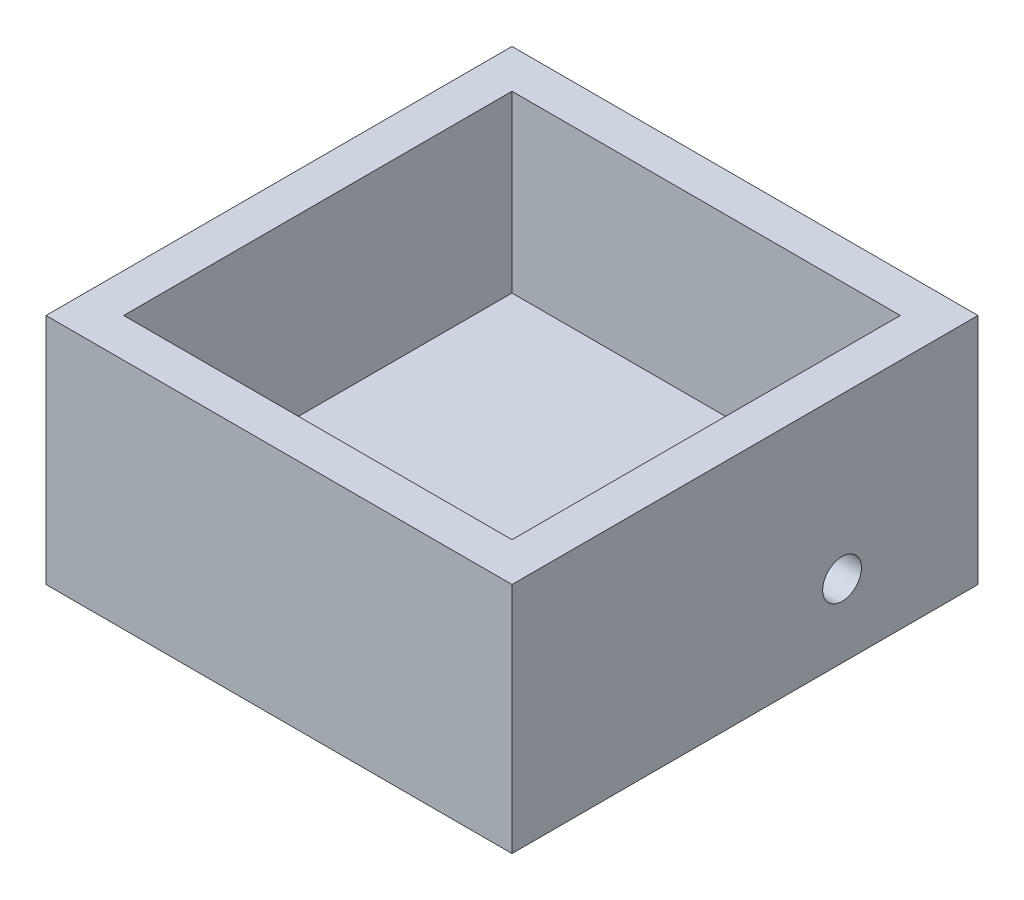
ISO-10303-21;
HEADER;
FILE_DESCRIPTION(('STEP AP214'),'2;1');
FILE_NAME('part.step','',(''),(''),'','','');
FILE_SCHEMA(('AUTOMOTIVE_DESIGN { 1 0 10303 214 1 1 1 1 }'));
ENDSEC;
DATA;
#1=APPLICATION_CONTEXT('core data for automotive mechanical design processes');
#2=APPLICATION_PROTOCOL_DEFINITION('international standard','automotive_design',2000,#1);
#3=PRODUCT_CONTEXT('',#1,'mechanical');
#4=PRODUCT('Part','Part','',(#3));
#5=PRODUCT_RELATED_PRODUCT_CATEGORY('part','',(#4));
#6=PRODUCT_DEFINITION_FORMATION('','',#4);
#7=PRODUCT_DEFINITION_CONTEXT('part definition',#1,'design');
#8=PRODUCT_DEFINITION('design','',#6,#7);
#9=PRODUCT_DEFINITION_SHAPE('','',#8);
#10=(LENGTH_UNIT() NAMED_UNIT(*) SI_UNIT(.MILLI.,.METRE.));
#11=(NAMED_UNIT(*) PLANE_ANGLE_UNIT() SI_UNIT($,.RADIAN.));
#12=(NAMED_UNIT(*) SI_UNIT($,.STERADIAN.) SOLID_ANGLE_UNIT());
#13=UNCERTAINTY_MEASURE_WITH_UNIT(LENGTH_MEASURE(1.E-05),#10,'distance_accuracy_value','');
#14=(GEOMETRIC_REPRESENTATION_CONTEXT(3) GLOBAL_UNCERTAINTY_ASSIGNED_CONTEXT((#13)) GLOBAL_UNIT_ASSIGNED_CONTEXT((#10,
#11,#12)) REPRESENTATION_CONTEXT('',''));
#15=CARTESIAN_POINT('',(0.,0.,0.));
#16=DIRECTION('',(0.,0.,1.));
#17=DIRECTION('',(1.,0.,0.));
#18=AXIS2_PLACEMENT_3D('',#15,#16,#17);
#19=CARTESIAN_POINT('',(0.,4.,0.));
#20=DIRECTION('',(0.,1.,0.));
#21=DIRECTION('',(0.,0.,1.));
#22=AXIS2_PLACEMENT_3D('',#19,#20,#21);
#23=PLANE('',#22);
#24=DIRECTION('',(0.,0.,1.));
#25=VECTOR('',#24,1.);
#26=CARTESIAN_POINT('',(-20.,4.,-20.));
#27=LINE('',#26,#25);
#28=CARTESIAN_POINT('',(-20.,4.,-20.));
#29=VERTEX_POINT('',#28);
#30=CARTESIAN_POINT('',(-20.,4.,20.));
#31=VERTEX_POINT('',#30);
#32=EDGE_CURVE('E160',#29,#31,#27,.T.);
#33=ORIENTED_EDGE('',*,*,#32,.T.);
#34=DIRECTION('',(1.,0.,0.));
#35=VECTOR('',#34,1.);
#36=CARTESIAN_POINT('',(-20.,4.,20.));
#37=LINE('',#36,#35);
#38=CARTESIAN_POINT('',(20.,4.,20.));
#39=VERTEX_POINT('',#38);
#40=EDGE_CURVE('E64',#31,#39,#37,.T.);
#41=ORIENTED_EDGE('',*,*,#40,.T.);
#42=DIRECTION('',(0.,0.,1.));
#43=VECTOR('',#42,1.);
#44=CARTESIAN_POINT('',(20.,4.,-20.));
#45=LINE('',#44,#43);
#46=CARTESIAN_POINT('',(20.,4.,-20.));
#47=VERTEX_POINT('',#46);
#48=EDGE_CURVE('E171',#47,#39,#45,.T.);
#49=ORIENTED_EDGE('',*,*,#48,.F.);
#50=DIRECTION('',(1.,0.,0.));
#51=VECTOR('',#50,1.);
#52=CARTESIAN_POINT('',(-20.,4.,-20.));
#53=LINE('',#52,#51);
#54=EDGE_CURVE('E174',#29,#47,#53,.T.);
#55=ORIENTED_EDGE('',*,*,#54,.F.);
#56=EDGE_LOOP('',(#33,#41,#49,#55));
#57=FACE_BOUND('',#56,.T.);
#58=DIRECTION('',(1.,0.,0.));
#59=VECTOR('',#58,1.);
#60=CARTESIAN_POINT('',(-15.,4.,15.));
#61=LINE('',#60,#59);
#62=CARTESIAN_POINT('',(-15.,4.,15.));
#63=VERTEX_POINT('',#62);
#64=CARTESIAN_POINT('',(15.,4.,15.));
#65=VERTEX_POINT('',#64);
#66=EDGE_CURVE('E455',#63,#65,#61,.T.);
#67=ORIENTED_EDGE('',*,*,#66,.F.);
#68=DIRECTION('',(0.,0.,1.));
#69=VECTOR('',#68,1.);
#70=CARTESIAN_POINT('',(-15.,4.,-15.));
#71=LINE('',#70,#69);
#72=CARTESIAN_POINT('',(-15.,4.,-15.));
#73=VERTEX_POINT('',#72);
#74=EDGE_CURVE('E157',#73,#63,#71,.T.);
#75=ORIENTED_EDGE('',*,*,#74,.F.);
#76=DIRECTION('',(-1.,0.,0.));
#77=VECTOR('',#76,1.);
#78=CARTESIAN_POINT('',(-15.,4.,-15.));
#79=LINE('',#78,#77);
#80=CARTESIAN_POINT('',(15.,4.,-15.));
#81=VERTEX_POINT('',#80);
#82=EDGE_CURVE('E153',#81,#73,#79,.T.);
#83=ORIENTED_EDGE('',*,*,#82,.F.);
#84=DIRECTION('',(0.,0.,-1.));
#85=VECTOR('',#84,1.);
#86=CARTESIAN_POINT('',(15.,4.,-15.));
#87=LINE('',#86,#85);
#88=EDGE_CURVE('E458',#65,#81,#87,.T.);
#89=ORIENTED_EDGE('',*,*,#88,.F.);
#90=EDGE_LOOP('',(#67,#75,#83,#89));
#91=FACE_BOUND('',#90,.T.);
#92=ADVANCED_FACE('F39',(#57,#91),#23,.T.);
#93=CARTESIAN_POINT('',(0.,24.,0.));
#94=DIRECTION('',(0.,1.,0.));
#95=DIRECTION('',(0.,0.,1.));
#96=AXIS2_PLACEMENT_3D('',#93,#94,#95);
#97=PLANE('',#96);
#98=DIRECTION('',(0.,0.,1.));
#99=VECTOR('',#98,1.);
#100=CARTESIAN_POINT('',(-24.,24.,-24.));
#101=LINE('',#100,#99);
#102=CARTESIAN_POINT('',(-24.,24.,-24.));
#103=VERTEX_POINT('',#102);
#104=CARTESIAN_POINT('',(-24.,24.,24.));
#105=VERTEX_POINT('',#104);
#106=EDGE_CURVE('E204',#103,#105,#101,.T.);
#107=ORIENTED_EDGE('',*,*,#106,.T.);
#108=DIRECTION('',(1.,0.,0.));
#109=VECTOR('',#108,1.);
#110=CARTESIAN_POINT('',(-24.,24.,24.));
#111=LINE('',#110,#109);
#112=CARTESIAN_POINT('',(24.,24.,24.));
#113=VERTEX_POINT('',#112);
#114=EDGE_CURVE('E208',#105,#113,#111,.T.);
#115=ORIENTED_EDGE('',*,*,#114,.T.);
#116=DIRECTION('',(0.,0.,-1.));
#117=VECTOR('',#116,1.);
#118=CARTESIAN_POINT('',(24.,24.,-24.));
#119=LINE('',#118,#117);
#120=CARTESIAN_POINT('',(24.,24.,-24.));
#121=VERTEX_POINT('',#120);
#122=EDGE_CURVE('E212',#113,#121,#119,.T.);
#123=ORIENTED_EDGE('',*,*,#122,.T.);
#124=DIRECTION('',(-1.,0.,0.));
#125=VECTOR('',#124,1.);
#126=CARTESIAN_POINT('',(-24.,24.,-24.));
#127=LINE('',#126,#125);
#128=EDGE_CURVE('E215',#121,#103,#127,.T.);
#129=ORIENTED_EDGE('',*,*,#128,.T.);
#130=EDGE_LOOP('',(#107,#115,#123,#129));
#131=FACE_BOUND('',#130,.T.);
#132=DIRECTION('',(1.,0.,0.));
#133=VECTOR('',#132,1.);
#134=CARTESIAN_POINT('',(-20.,24.,20.));
#135=LINE('',#134,#133);
#136=CARTESIAN_POINT('',(-20.,24.,20.));
#137=VERTEX_POINT('',#136);
#138=CARTESIAN_POINT('',(20.,24.,20.));
#139=VERTEX_POINT('',#138);
#140=EDGE_CURVE('E180',#137,#139,#135,.T.);
#141=ORIENTED_EDGE('',*,*,#140,.F.);
#142=DIRECTION('',(0.,0.,1.));
#143=VECTOR('',#142,1.);
#144=CARTESIAN_POINT('',(-20.,24.,-20.));
#145=LINE('',#144,#143);
#146=CARTESIAN_POINT('',(-20.,24.,-20.));
#147=VERTEX_POINT('',#146);
#148=EDGE_CURVE('E177',#147,#137,#145,.T.);
#149=ORIENTED_EDGE('',*,*,#148,.F.);
#150=DIRECTION('',(-1.,0.,0.));
#151=VECTOR('',#150,1.);
#152=CARTESIAN_POINT('',(-20.,24.,-20.));
#153=LINE('',#152,#151);
#154=CARTESIAN_POINT('',(20.,24.,-20.));
#155=VERTEX_POINT('',#154);
#156=EDGE_CURVE('E187',#155,#147,#153,.T.);
#157=ORIENTED_EDGE('',*,*,#156,.F.);
#158=DIRECTION('',(0.,0.,-1.));
#159=VECTOR('',#158,1.);
#160=CARTESIAN_POINT('',(20.,24.,-20.));
#161=LINE('',#160,#159);
#162=EDGE_CURVE('E183',#139,#155,#161,.T.);
#163=ORIENTED_EDGE('',*,*,#162,.F.);
#164=EDGE_LOOP('',(#141,#149,#157,#163));
#165=FACE_BOUND('',#164,.T.);
#166=ADVANCED_FACE('F258',(#131,#165),#97,.T.);
#167=CARTESIAN_POINT('',(0.,0.,0.));
#168=DIRECTION('',(0.,1.,0.));
#169=DIRECTION('',(0.,0.,1.));
#170=AXIS2_PLACEMENT_3D('',#167,#168,#169);
#171=PLANE('',#170);
#172=DIRECTION('',(0.,0.,1.));
#173=VECTOR('',#172,1.);
#174=CARTESIAN_POINT('',(-24.,0.,-24.));
#175=LINE('',#174,#173);
#176=CARTESIAN_POINT('',(-24.,0.,-24.));
#177=VERTEX_POINT('',#176);
#178=CARTESIAN_POINT('',(-24.,0.,24.));
#179=VERTEX_POINT('',#178);
#180=EDGE_CURVE('E203',#177,#179,#175,.T.);
#181=ORIENTED_EDGE('',*,*,#180,.F.);
#182=DIRECTION('',(-1.,0.,0.));
#183=VECTOR('',#182,1.);
#184=CARTESIAN_POINT('',(-24.,0.,-24.));
#185=LINE('',#184,#183);
#186=CARTESIAN_POINT('',(24.,0.,-24.));
#187=VERTEX_POINT('',#186);
#188=EDGE_CURVE('E209',#187,#177,#185,.T.);
#189=ORIENTED_EDGE('',*,*,#188,.F.);
#190=DIRECTION('',(0.,0.,-1.));
#191=VECTOR('',#190,1.);
#192=CARTESIAN_POINT('',(24.,0.,-24.));
#193=LINE('',#192,#191);
#194=CARTESIAN_POINT('',(24.,0.,24.));
#195=VERTEX_POINT('',#194);
#196=EDGE_CURVE('E225',#195,#187,#193,.T.);
#197=ORIENTED_EDGE('',*,*,#196,.F.);
#198=DIRECTION('',(1.,0.,0.));
#199=VECTOR('',#198,1.);
#200=CARTESIAN_POINT('',(-24.,0.,24.));
#201=LINE('',#200,#199);
#202=EDGE_CURVE('E222',#179,#195,#201,.T.);
#203=ORIENTED_EDGE('',*,*,#202,.F.);
#204=EDGE_LOOP('',(#181,#189,#197,#203));
#205=FACE_BOUND('',#204,.T.);
#206=ADVANCED_FACE('F249',(#205),#171,.F.);
#207=CARTESIAN_POINT('',(-24.,24.,-24.));
#208=DIRECTION('',(1.,0.,0.));
#209=DIRECTION('',(0.,0.,-1.));
#210=AXIS2_PLACEMENT_3D('',#207,#208,#209);
#211=PLANE('',#210);
#212=ORIENTED_EDGE('',*,*,#180,.T.);
#213=DIRECTION('',(0.,-1.,0.));
#214=VECTOR('',#213,1.);
#215=CARTESIAN_POINT('',(-24.,24.,24.));
#216=LINE('',#215,#214);
#217=EDGE_CURVE('E11',#105,#179,#216,.T.);
#218=ORIENTED_EDGE('',*,*,#217,.F.);
#219=ORIENTED_EDGE('',*,*,#106,.F.);
#220=DIRECTION('',(0.,-1.,0.));
#221=VECTOR('',#220,1.);
#222=CARTESIAN_POINT('',(-24.,24.,-24.));
#223=LINE('',#222,#221);
#224=EDGE_CURVE('E218',#103,#177,#223,.T.);
#225=ORIENTED_EDGE('',*,*,#224,.T.);
#226=EDGE_LOOP('',(#212,#218,#219,#225));
#227=FACE_BOUND('',#226,.T.);
#228=ADVANCED_FACE('F41',(#227),#211,.F.);
#229=CARTESIAN_POINT('',(-24.,24.,24.));
#230=DIRECTION('',(0.,0.,-1.));
#231=DIRECTION('',(-1.,0.,0.));
#232=AXIS2_PLACEMENT_3D('',#229,#230,#231);
#233=PLANE('',#232);
#234=ORIENTED_EDGE('',*,*,#202,.T.);
#235=DIRECTION('',(0.,-1.,0.));
#236=VECTOR('',#235,1.);
#237=CARTESIAN_POINT('',(24.,24.,24.));
#238=LINE('',#237,#236);
#239=EDGE_CURVE('E49',#113,#195,#238,.T.);
#240=ORIENTED_EDGE('',*,*,#239,.F.);
#241=ORIENTED_EDGE('',*,*,#114,.F.);
#242=ORIENTED_EDGE('',*,*,#217,.T.);
#243=EDGE_LOOP('',(#234,#240,#241,#242));
#244=FACE_BOUND('',#243,.T.);
#245=ADVANCED_FACE('F260',(#244),#233,.F.);
#246=CARTESIAN_POINT('',(24.,24.,-24.));
#247=DIRECTION('',(-1.,0.,0.));
#248=DIRECTION('',(0.,0.,1.));
#249=AXIS2_PLACEMENT_3D('',#246,#247,#248);
#250=PLANE('',#249);
#251=CARTESIAN_POINT('',(24.,7.5,-10.));
#252=DIRECTION('',(1.,0.,0.));
#253=DIRECTION('',(0.,0.,-1.));
#254=AXIS2_PLACEMENT_3D('',#251,#252,#253);
#255=CIRCLE('',#254,2.);
#256=CARTESIAN_POINT('',(24.,7.5,-12.));
#257=VERTEX_POINT('',#256);
#258=EDGE_CURVE('E438',#257,#257,#255,.T.);
#259=ORIENTED_EDGE('',*,*,#258,.F.);
#260=EDGE_LOOP('',(#259));
#261=FACE_BOUND('',#260,.T.);
#262=ORIENTED_EDGE('',*,*,#196,.T.);
#263=DIRECTION('',(0.,-1.,0.));
#264=VECTOR('',#263,1.);
#265=CARTESIAN_POINT('',(24.,24.,-24.));
#266=LINE('',#265,#264);
#267=EDGE_CURVE('E233',#121,#187,#266,.T.);
#268=ORIENTED_EDGE('',*,*,#267,.F.);
#269=ORIENTED_EDGE('',*,*,#122,.F.);
#270=ORIENTED_EDGE('',*,*,#239,.T.);
#271=EDGE_LOOP('',(#262,#268,#269,#270));
#272=FACE_BOUND('',#271,.T.);
#273=ADVANCED_FACE('F243',(#261,#272),#250,.F.);
#274=CARTESIAN_POINT('',(-24.,24.,-24.));
#275=DIRECTION('',(0.,0.,1.));
#276=DIRECTION('',(1.,0.,0.));
#277=AXIS2_PLACEMENT_3D('',#274,#275,#276);
#278=PLANE('',#277);
#279=ORIENTED_EDGE('',*,*,#188,.T.);
#280=ORIENTED_EDGE('',*,*,#224,.F.);
#281=ORIENTED_EDGE('',*,*,#128,.F.);
#282=ORIENTED_EDGE('',*,*,#267,.T.);
#283=EDGE_LOOP('',(#279,#280,#281,#282));
#284=FACE_BOUND('',#283,.T.);
#285=ADVANCED_FACE('F252',(#284),#278,.F.);
#286=CARTESIAN_POINT('',(-20.,24.,-20.));
#287=DIRECTION('',(1.,0.,0.));
#288=DIRECTION('',(0.,0.,-1.));
#289=AXIS2_PLACEMENT_3D('',#286,#287,#288);
#290=PLANE('',#289);
#291=ORIENTED_EDGE('',*,*,#32,.F.);
#292=DIRECTION('',(0.,-1.,0.));
#293=VECTOR('',#292,1.);
#294=CARTESIAN_POINT('',(-20.,24.,-20.));
#295=LINE('',#294,#293);
#296=EDGE_CURVE('E190',#147,#29,#295,.T.);
#297=ORIENTED_EDGE('',*,*,#296,.F.);
#298=ORIENTED_EDGE('',*,*,#148,.T.);
#299=DIRECTION('',(0.,-1.,0.));
#300=VECTOR('',#299,1.);
#301=CARTESIAN_POINT('',(-20.,24.,20.));
#302=LINE('',#301,#300);
#303=EDGE_CURVE('E200',#137,#31,#302,.T.);
#304=ORIENTED_EDGE('',*,*,#303,.T.);
#305=EDGE_LOOP('',(#291,#297,#298,#304));
#306=FACE_BOUND('',#305,.T.);
#307=ADVANCED_FACE('F290',(#306),#290,.T.);
#308=CARTESIAN_POINT('',(-20.,24.,20.));
#309=DIRECTION('',(0.,0.,-1.));
#310=DIRECTION('',(-1.,0.,0.));
#311=AXIS2_PLACEMENT_3D('',#308,#309,#310);
#312=PLANE('',#311);
#313=ORIENTED_EDGE('',*,*,#40,.F.);
#314=ORIENTED_EDGE('',*,*,#303,.F.);
#315=ORIENTED_EDGE('',*,*,#140,.T.);
#316=DIRECTION('',(0.,-1.,0.));
#317=VECTOR('',#316,1.);
#318=CARTESIAN_POINT('',(20.,24.,20.));
#319=LINE('',#318,#317);
#320=EDGE_CURVE('E197',#139,#39,#319,.T.);
#321=ORIENTED_EDGE('',*,*,#320,.T.);
#322=EDGE_LOOP('',(#313,#314,#315,#321));
#323=FACE_BOUND('',#322,.T.);
#324=ADVANCED_FACE('F286',(#323),#312,.T.);
#325=CARTESIAN_POINT('',(20.,24.,-20.));
#326=DIRECTION('',(-1.,0.,0.));
#327=DIRECTION('',(0.,0.,1.));
#328=AXIS2_PLACEMENT_3D('',#325,#326,#327);
#329=PLANE('',#328);
#330=CARTESIAN_POINT('',(20.,7.5,-10.));
#331=DIRECTION('',(-1.,0.,0.));
#332=DIRECTION('',(0.,0.,1.));
#333=AXIS2_PLACEMENT_3D('',#330,#331,#332);
#334=CIRCLE('',#333,2.);
#335=CARTESIAN_POINT('',(20.,7.5,-8.));
#336=VERTEX_POINT('',#335);
#337=EDGE_CURVE('E435',#336,#336,#334,.T.);
#338=ORIENTED_EDGE('',*,*,#337,.F.);
#339=EDGE_LOOP('',(#338));
#340=FACE_BOUND('',#339,.T.);
#341=ORIENTED_EDGE('',*,*,#48,.T.);
#342=ORIENTED_EDGE('',*,*,#320,.F.);
#343=ORIENTED_EDGE('',*,*,#162,.T.);
#344=DIRECTION('',(0.,-1.,0.));
#345=VECTOR('',#344,1.);
#346=CARTESIAN_POINT('',(20.,24.,-20.));
#347=LINE('',#346,#345);
#348=EDGE_CURVE('E193',#155,#47,#347,.T.);
#349=ORIENTED_EDGE('',*,*,#348,.T.);
#350=EDGE_LOOP('',(#341,#342,#343,#349));
#351=FACE_BOUND('',#350,.T.);
#352=ADVANCED_FACE('F282',(#340,#351),#329,.T.);
#353=CARTESIAN_POINT('',(-20.,24.,-20.));
#354=DIRECTION('',(0.,0.,1.));
#355=DIRECTION('',(1.,0.,0.));
#356=AXIS2_PLACEMENT_3D('',#353,#354,#355);
#357=PLANE('',#356);
#358=ORIENTED_EDGE('',*,*,#54,.T.);
#359=ORIENTED_EDGE('',*,*,#348,.F.);
#360=ORIENTED_EDGE('',*,*,#156,.T.);
#361=ORIENTED_EDGE('',*,*,#296,.T.);
#362=EDGE_LOOP('',(#358,#359,#360,#361));
#363=FACE_BOUND('',#362,.T.);
#364=ADVANCED_FACE('F279',(#363),#357,.T.);
#365=CARTESIAN_POINT('',(-15.,11.,-15.));
#366=DIRECTION('',(1.,0.,0.));
#367=DIRECTION('',(0.,0.,-1.));
#368=AXIS2_PLACEMENT_3D('',#365,#366,#367);
#369=PLANE('',#368);
#370=ORIENTED_EDGE('',*,*,#74,.T.);
#371=DIRECTION('',(0.,-1.,0.));
#372=VECTOR('',#371,1.);
#373=CARTESIAN_POINT('',(-15.,11.,15.));
#374=LINE('',#373,#372);
#375=CARTESIAN_POINT('',(-15.,11.,15.));
#376=VERTEX_POINT('',#375);
#377=EDGE_CURVE('E136',#376,#63,#374,.T.);
#378=ORIENTED_EDGE('',*,*,#377,.F.);
#379=DIRECTION('',(0.,0.,1.));
#380=VECTOR('',#379,1.);
#381=CARTESIAN_POINT('',(-15.,11.,-15.));
#382=LINE('',#381,#380);
#383=CARTESIAN_POINT('',(-15.,11.,-15.));
#384=VERTEX_POINT('',#383);
#385=EDGE_CURVE('E144',#384,#376,#382,.T.);
#386=ORIENTED_EDGE('',*,*,#385,.F.);
#387=DIRECTION('',(0.,-1.,0.));
#388=VECTOR('',#387,1.);
#389=CARTESIAN_POINT('',(-15.,11.,-15.));
#390=LINE('',#389,#388);
#391=EDGE_CURVE('E452',#384,#73,#390,.T.);
#392=ORIENTED_EDGE('',*,*,#391,.T.);
#393=EDGE_LOOP('',(#370,#378,#386,#392));
#394=FACE_BOUND('',#393,.T.);
#395=ADVANCED_FACE('F155',(#394),#369,.F.);
#396=CARTESIAN_POINT('',(-15.,11.,15.));
#397=DIRECTION('',(0.,0.,-1.));
#398=DIRECTION('',(-1.,0.,0.));
#399=AXIS2_PLACEMENT_3D('',#396,#397,#398);
#400=PLANE('',#399);
#401=ORIENTED_EDGE('',*,*,#66,.T.);
#402=DIRECTION('',(0.,-1.,0.));
#403=VECTOR('',#402,1.);
#404=CARTESIAN_POINT('',(15.,11.,15.));
#405=LINE('',#404,#403);
#406=CARTESIAN_POINT('',(15.,11.,15.));
#407=VERTEX_POINT('',#406);
#408=EDGE_CURVE('E139',#407,#65,#405,.T.);
#409=ORIENTED_EDGE('',*,*,#408,.F.);
#410=DIRECTION('',(1.,0.,0.));
#411=VECTOR('',#410,1.);
#412=CARTESIAN_POINT('',(-15.,11.,15.));
#413=LINE('',#412,#411);
#414=EDGE_CURVE('E132',#376,#407,#413,.T.);
#415=ORIENTED_EDGE('',*,*,#414,.F.);
#416=ORIENTED_EDGE('',*,*,#377,.T.);
#417=EDGE_LOOP('',(#401,#409,#415,#416));
#418=FACE_BOUND('',#417,.T.);
#419=ADVANCED_FACE('F134',(#418),#400,.F.);
#420=CARTESIAN_POINT('',(15.,11.,-15.));
#421=DIRECTION('',(-1.,0.,0.));
#422=DIRECTION('',(0.,0.,1.));
#423=AXIS2_PLACEMENT_3D('',#420,#421,#422);
#424=PLANE('',#423);
#425=CARTESIAN_POINT('',(15.,7.5,-10.));
#426=DIRECTION('',(-1.,0.,0.));
#427=DIRECTION('',(0.,0.,1.));
#428=AXIS2_PLACEMENT_3D('',#425,#426,#427);
#429=CIRCLE('',#428,2.);
#430=CARTESIAN_POINT('',(15.,7.5,-7.99999999999999));
#431=VERTEX_POINT('',#430);
#432=EDGE_CURVE('E43',#431,#431,#429,.T.);
#433=ORIENTED_EDGE('',*,*,#432,.T.);
#434=EDGE_LOOP('',(#433));
#435=FACE_BOUND('',#434,.T.);
#436=ORIENTED_EDGE('',*,*,#88,.T.);
#437=DIRECTION('',(0.,-1.,0.));
#438=VECTOR('',#437,1.);
#439=CARTESIAN_POINT('',(15.,11.,-15.));
#440=LINE('',#439,#438);
#441=CARTESIAN_POINT('',(15.,11.,-15.));
#442=VERTEX_POINT('',#441);
#443=EDGE_CURVE('E56',#442,#81,#440,.T.);
#444=ORIENTED_EDGE('',*,*,#443,.F.);
#445=DIRECTION('',(0.,0.,-1.));
#446=VECTOR('',#445,1.);
#447=CARTESIAN_POINT('',(15.,11.,-15.));
#448=LINE('',#447,#446);
#449=EDGE_CURVE('E143',#407,#442,#448,.T.);
#450=ORIENTED_EDGE('',*,*,#449,.F.);
#451=ORIENTED_EDGE('',*,*,#408,.T.);
#452=EDGE_LOOP('',(#436,#444,#450,#451));
#453=FACE_BOUND('',#452,.T.);
#454=ADVANCED_FACE('F330',(#435,#453),#424,.F.);
#455=CARTESIAN_POINT('',(-15.,11.,-15.));
#456=DIRECTION('',(0.,0.,1.));
#457=DIRECTION('',(1.,0.,0.));
#458=AXIS2_PLACEMENT_3D('',#455,#456,#457);
#459=PLANE('',#458);
#460=ORIENTED_EDGE('',*,*,#82,.T.);
#461=ORIENTED_EDGE('',*,*,#391,.F.);
#462=DIRECTION('',(-1.,0.,0.));
#463=VECTOR('',#462,1.);
#464=CARTESIAN_POINT('',(-15.,11.,-15.));
#465=LINE('',#464,#463);
#466=EDGE_CURVE('E148',#442,#384,#465,.T.);
#467=ORIENTED_EDGE('',*,*,#466,.F.);
#468=ORIENTED_EDGE('',*,*,#443,.T.);
#469=EDGE_LOOP('',(#460,#461,#467,#468));
#470=FACE_BOUND('',#469,.T.);
#471=ADVANCED_FACE('F336',(#470),#459,.F.);
#472=CARTESIAN_POINT('',(0.,11.,0.));
#473=DIRECTION('',(0.,1.,0.));
#474=DIRECTION('',(0.,0.,1.));
#475=AXIS2_PLACEMENT_3D('',#472,#473,#474);
#476=PLANE('',#475);
#477=ORIENTED_EDGE('',*,*,#385,.T.);
#478=ORIENTED_EDGE('',*,*,#414,.T.);
#479=ORIENTED_EDGE('',*,*,#449,.T.);
#480=ORIENTED_EDGE('',*,*,#466,.T.);
#481=EDGE_LOOP('',(#477,#478,#479,#480));
#482=FACE_BOUND('',#481,.T.);
#483=ADVANCED_FACE('F147',(#482),#476,.T.);
#484=CARTESIAN_POINT('',(-1.,7.5,-10.));
#485=DIRECTION('',(1.,0.,0.));
#486=DIRECTION('',(0.,0.,-1.));
#487=AXIS2_PLACEMENT_3D('',#484,#485,#486);
#488=PLANE('',#487);
#489=CARTESIAN_POINT('',(-1.,7.5,-10.));
#490=DIRECTION('',(1.,0.,0.));
#491=DIRECTION('',(0.,0.,-1.));
#492=AXIS2_PLACEMENT_3D('',#489,#490,#491);
#493=CIRCLE('',#492,2.);
#494=CARTESIAN_POINT('',(-1.,7.5,-12.));
#495=VERTEX_POINT('',#494);
#496=EDGE_CURVE('E440',#495,#495,#493,.T.);
#497=ORIENTED_EDGE('',*,*,#496,.T.);
#498=EDGE_LOOP('',(#497));
#499=FACE_BOUND('',#498,.T.);
#500=ADVANCED_FACE('F350',(#499),#488,.T.);
#501=CARTESIAN_POINT('',(-1.,7.5,-10.));
#502=DIRECTION('',(1.,0.,0.));
#503=DIRECTION('',(0.,0.,-1.));
#504=AXIS2_PLACEMENT_3D('',#501,#502,#503);
#505=CYLINDRICAL_SURFACE('',#504,2.);
#506=ORIENTED_EDGE('',*,*,#496,.F.);
#507=EDGE_LOOP('',(#506));
#508=FACE_BOUND('',#507,.T.);
#509=ORIENTED_EDGE('',*,*,#432,.F.);
#510=EDGE_LOOP('',(#509));
#511=FACE_BOUND('',#510,.T.);
#512=ADVANCED_FACE('F356',(#508,#511),#505,.F.);
#513=ORIENTED_EDGE('',*,*,#337,.T.);
#514=EDGE_LOOP('',(#513));
#515=FACE_BOUND('',#514,.T.);
#516=ORIENTED_EDGE('',*,*,#258,.T.);
#517=EDGE_LOOP('',(#516));
#518=FACE_BOUND('',#517,.T.);
#519=ADVANCED_FACE('F364',(#515,#518),#505,.F.);
#520=CLOSED_SHELL('',(#92,#166,#206,#228,#245,#273,#285,#307,#324,#352,#364,#395,#419,#454,#471,
#483,#500,#512,#519));
#521=MANIFOLD_SOLID_BREP('B2',#520);
#522=ADVANCED_BREP_SHAPE_REPRESENTATION('',(#18,#521),#14);
#523=SHAPE_DEFINITION_REPRESENTATION(#9,#522);
ENDSEC;
END-ISO-10303-21;
